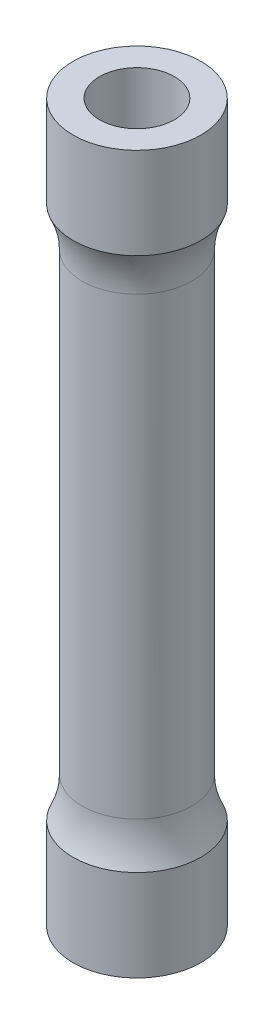
ISO-10303-21;
HEADER;
FILE_DESCRIPTION(('STEP AP214'),'2;1');
FILE_NAME('part.step','',(''),(''),'','','');
FILE_SCHEMA(('AUTOMOTIVE_DESIGN { 1 0 10303 214 1 1 1 1 }'));
ENDSEC;
DATA;
#1=APPLICATION_CONTEXT('core data for automotive mechanical design processes');
#2=APPLICATION_PROTOCOL_DEFINITION('international standard','automotive_design',2000,#1);
#3=PRODUCT_CONTEXT('',#1,'mechanical');
#4=PRODUCT('Part','Part','',(#3));
#5=PRODUCT_RELATED_PRODUCT_CATEGORY('part','',(#4));
#6=PRODUCT_DEFINITION_FORMATION('','',#4);
#7=PRODUCT_DEFINITION_CONTEXT('part definition',#1,'design');
#8=PRODUCT_DEFINITION('design','',#6,#7);
#9=PRODUCT_DEFINITION_SHAPE('','',#8);
#10=(LENGTH_UNIT() NAMED_UNIT(*) SI_UNIT(.MILLI.,.METRE.));
#11=(NAMED_UNIT(*) PLANE_ANGLE_UNIT() SI_UNIT($,.RADIAN.));
#12=(NAMED_UNIT(*) SI_UNIT($,.STERADIAN.) SOLID_ANGLE_UNIT());
#13=UNCERTAINTY_MEASURE_WITH_UNIT(LENGTH_MEASURE(1.E-05),#10,'distance_accuracy_value','');
#14=(GEOMETRIC_REPRESENTATION_CONTEXT(3) GLOBAL_UNCERTAINTY_ASSIGNED_CONTEXT((#13)) GLOBAL_UNIT_ASSIGNED_CONTEXT((#10,
#11,#12)) REPRESENTATION_CONTEXT('',''));
#15=CARTESIAN_POINT('',(0.,0.,0.));
#16=DIRECTION('',(0.,0.,1.));
#17=DIRECTION('',(1.,0.,0.));
#18=AXIS2_PLACEMENT_3D('',#15,#16,#17);
#19=CARTESIAN_POINT('',(0.,-39.25,0.));
#20=DIRECTION('',(0.,1.,0.));
#21=DIRECTION('',(0.,0.,1.));
#22=AXIS2_PLACEMENT_3D('',#19,#20,#21);
#23=CYLINDRICAL_SURFACE('',#22,6.);
#24=CARTESIAN_POINT('',(0.,-24.8911010564593,0.));
#25=DIRECTION('',(0.,-1.,0.));
#26=DIRECTION('',(0.,0.,-1.));
#27=AXIS2_PLACEMENT_3D('',#24,#25,#26);
#28=CIRCLE('',#27,6.);
#29=CARTESIAN_POINT('',(0.,-24.8911010564593,-6.));
#30=VERTEX_POINT('',#29);
#31=EDGE_CURVE('E10',#30,#30,#28,.F.);
#32=ORIENTED_EDGE('',*,*,#31,.T.);
#33=EDGE_LOOP('',(#32));
#34=FACE_BOUND('',#33,.T.);
#35=CARTESIAN_POINT('',(0.,24.8911010564593,0.));
#36=DIRECTION('',(0.,1.,0.));
#37=DIRECTION('',(0.,0.,1.));
#38=AXIS2_PLACEMENT_3D('',#35,#36,#37);
#39=CIRCLE('',#38,6.);
#40=CARTESIAN_POINT('',(0.,24.8911010564593,6.));
#41=VERTEX_POINT('',#40);
#42=EDGE_CURVE('E42',#41,#41,#39,.F.);
#43=ORIENTED_EDGE('',*,*,#42,.T.);
#44=EDGE_LOOP('',(#43));
#45=FACE_BOUND('',#44,.T.);
#46=ADVANCED_FACE('F35',(#34,#45),#23,.T.);
#47=CARTESIAN_POINT('',(0.,-39.25,0.));
#48=DIRECTION('',(0.,1.,0.));
#49=DIRECTION('',(0.,0.,1.));
#50=AXIS2_PLACEMENT_3D('',#47,#48,#49);
#51=PLANE('',#50);
#52=CARTESIAN_POINT('',(0.,-39.25,0.));
#53=DIRECTION('',(0.,1.,0.));
#54=DIRECTION('',(0.,0.,1.));
#55=AXIS2_PLACEMENT_3D('',#52,#53,#54);
#56=CIRCLE('',#55,4.1);
#57=CARTESIAN_POINT('',(0.,-39.25,4.1));
#58=VERTEX_POINT('',#57);
#59=EDGE_CURVE('E46',#58,#58,#56,.T.);
#60=ORIENTED_EDGE('',*,*,#59,.T.);
#61=EDGE_LOOP('',(#60));
#62=FACE_BOUND('',#61,.T.);
#63=CARTESIAN_POINT('',(0.,-39.25,0.));
#64=DIRECTION('',(0.,1.,0.));
#65=DIRECTION('',(0.,0.,1.));
#66=AXIS2_PLACEMENT_3D('',#63,#64,#65);
#67=CIRCLE('',#66,7.);
#68=CARTESIAN_POINT('',(0.,-39.25,7.));
#69=VERTEX_POINT('',#68);
#70=EDGE_CURVE('E62',#69,#69,#67,.T.);
#71=ORIENTED_EDGE('',*,*,#70,.F.);
#72=EDGE_LOOP('',(#71));
#73=FACE_BOUND('',#72,.T.);
#74=ADVANCED_FACE('F78',(#62,#73),#51,.F.);
#75=CARTESIAN_POINT('',(0.,-39.25,0.));
#76=DIRECTION('',(0.,1.,0.));
#77=DIRECTION('',(0.,0.,1.));
#78=AXIS2_PLACEMENT_3D('',#75,#76,#77);
#79=CYLINDRICAL_SURFACE('',#78,4.1);
#80=ORIENTED_EDGE('',*,*,#59,.F.);
#81=EDGE_LOOP('',(#80));
#82=FACE_BOUND('',#81,.T.);
#83=CARTESIAN_POINT('',(0.,39.25,0.));
#84=DIRECTION('',(0.,1.,0.));
#85=DIRECTION('',(0.,0.,1.));
#86=AXIS2_PLACEMENT_3D('',#83,#84,#85);
#87=CIRCLE('',#86,4.1);
#88=CARTESIAN_POINT('',(0.,39.25,4.1));
#89=VERTEX_POINT('',#88);
#90=EDGE_CURVE('E50',#89,#89,#87,.T.);
#91=ORIENTED_EDGE('',*,*,#90,.T.);
#92=EDGE_LOOP('',(#91));
#93=FACE_BOUND('',#92,.T.);
#94=ADVANCED_FACE('F80',(#82,#93),#79,.F.);
#95=CARTESIAN_POINT('',(0.,39.25,0.));
#96=DIRECTION('',(0.,1.,0.));
#97=DIRECTION('',(0.,0.,1.));
#98=AXIS2_PLACEMENT_3D('',#95,#96,#97);
#99=PLANE('',#98);
#100=ORIENTED_EDGE('',*,*,#90,.F.);
#101=EDGE_LOOP('',(#100));
#102=FACE_BOUND('',#101,.T.);
#103=CARTESIAN_POINT('',(0.,39.25,0.));
#104=DIRECTION('',(0.,1.,0.));
#105=DIRECTION('',(0.,0.,1.));
#106=AXIS2_PLACEMENT_3D('',#103,#104,#105);
#107=CIRCLE('',#106,7.);
#108=CARTESIAN_POINT('',(0.,39.25,7.));
#109=VERTEX_POINT('',#108);
#110=EDGE_CURVE('E56',#109,#109,#107,.T.);
#111=ORIENTED_EDGE('',*,*,#110,.T.);
#112=EDGE_LOOP('',(#111));
#113=FACE_BOUND('',#112,.T.);
#114=ADVANCED_FACE('F87',(#102,#113),#99,.T.);
#115=CARTESIAN_POINT('',(0.,29.25,0.));
#116=DIRECTION('',(0.,1.,0.));
#117=DIRECTION('',(0.,0.,1.));
#118=AXIS2_PLACEMENT_3D('',#115,#116,#117);
#119=CYLINDRICAL_SURFACE('',#118,7.);
#120=CARTESIAN_POINT('',(0.,29.25,0.));
#121=DIRECTION('',(0.,1.,0.));
#122=DIRECTION('',(0.,0.,1.));
#123=AXIS2_PLACEMENT_3D('',#120,#121,#122);
#124=CIRCLE('',#123,7.);
#125=CARTESIAN_POINT('',(0.,29.25,7.));
#126=VERTEX_POINT('',#125);
#127=EDGE_CURVE('E55',#126,#126,#124,.T.);
#128=ORIENTED_EDGE('',*,*,#127,.T.);
#129=EDGE_LOOP('',(#128));
#130=FACE_BOUND('',#129,.T.);
#131=ORIENTED_EDGE('',*,*,#110,.F.);
#132=EDGE_LOOP('',(#131));
#133=FACE_BOUND('',#132,.T.);
#134=ADVANCED_FACE('F74',(#130,#133),#119,.T.);
#135=CARTESIAN_POINT('',(0.,-29.25,0.));
#136=DIRECTION('',(0.,-1.,0.));
#137=DIRECTION('',(0.,0.,-1.));
#138=AXIS2_PLACEMENT_3D('',#135,#136,#137);
#139=CYLINDRICAL_SURFACE('',#138,7.);
#140=CARTESIAN_POINT('',(0.,-29.25,0.));
#141=DIRECTION('',(0.,1.,0.));
#142=DIRECTION('',(0.,0.,1.));
#143=AXIS2_PLACEMENT_3D('',#140,#141,#142);
#144=CIRCLE('',#143,7.);
#145=CARTESIAN_POINT('',(0.,-29.25,7.));
#146=VERTEX_POINT('',#145);
#147=EDGE_CURVE('E59',#146,#146,#144,.T.);
#148=ORIENTED_EDGE('',*,*,#147,.F.);
#149=EDGE_LOOP('',(#148));
#150=FACE_BOUND('',#149,.T.);
#151=ORIENTED_EDGE('',*,*,#70,.T.);
#152=EDGE_LOOP('',(#151));
#153=FACE_BOUND('',#152,.T.);
#154=ADVANCED_FACE('F71',(#150,#153),#139,.T.);
#155=CARTESIAN_POINT('',(0.,-24.8911010564593,0.));
#156=DIRECTION('',(0.,-1.,0.));
#157=DIRECTION('',(0.,0.,-1.));
#158=AXIS2_PLACEMENT_3D('',#155,#156,#157);
#159=TOROIDAL_SURFACE('',#158,16.,10.);
#160=ORIENTED_EDGE('',*,*,#147,.T.);
#161=EDGE_LOOP('',(#160));
#162=FACE_BOUND('',#161,.T.);
#163=ORIENTED_EDGE('',*,*,#31,.F.);
#164=EDGE_LOOP('',(#163));
#165=FACE_BOUND('',#164,.T.);
#166=ADVANCED_FACE('F68',(#162,#165),#159,.F.);
#167=CARTESIAN_POINT('',(0.,24.8911010564593,0.));
#168=DIRECTION('',(0.,1.,0.));
#169=DIRECTION('',(0.,0.,1.));
#170=AXIS2_PLACEMENT_3D('',#167,#168,#169);
#171=TOROIDAL_SURFACE('',#170,16.,10.);
#172=ORIENTED_EDGE('',*,*,#127,.F.);
#173=EDGE_LOOP('',(#172));
#174=FACE_BOUND('',#173,.T.);
#175=ORIENTED_EDGE('',*,*,#42,.F.);
#176=EDGE_LOOP('',(#175));
#177=FACE_BOUND('',#176,.T.);
#178=ADVANCED_FACE('F37',(#174,#177),#171,.F.);
#179=CLOSED_SHELL('',(#46,#74,#94,#114,#134,#154,#166,#178));
#180=MANIFOLD_SOLID_BREP('B2',#179);
#181=ADVANCED_BREP_SHAPE_REPRESENTATION('',(#18,#180),#14);
#182=SHAPE_DEFINITION_REPRESENTATION(#9,#181);
ENDSEC;
END-ISO-10303-21;
